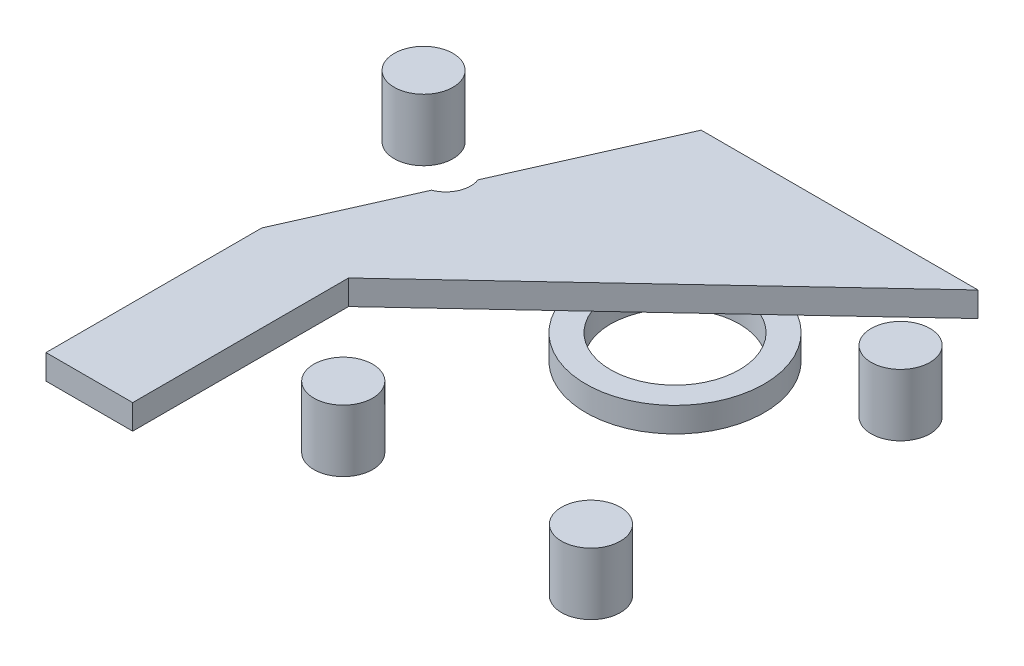
ISO-10303-21;
HEADER;
FILE_DESCRIPTION(('STEP AP214'),'2;1');
FILE_NAME('part.step','',(''),(''),'','','');
FILE_SCHEMA(('AUTOMOTIVE_DESIGN { 1 0 10303 214 1 1 1 1 }'));
ENDSEC;
DATA;
#1=APPLICATION_CONTEXT('core data for automotive mechanical design processes');
#2=APPLICATION_PROTOCOL_DEFINITION('international standard','automotive_design',2000,#1);
#3=PRODUCT_CONTEXT('',#1,'mechanical');
#4=PRODUCT('Part','Part','',(#3));
#5=PRODUCT_RELATED_PRODUCT_CATEGORY('part','',(#4));
#6=PRODUCT_DEFINITION_FORMATION('','',#4);
#7=PRODUCT_DEFINITION_CONTEXT('part definition',#1,'design');
#8=PRODUCT_DEFINITION('design','',#6,#7);
#9=PRODUCT_DEFINITION_SHAPE('','',#8);
#10=(LENGTH_UNIT() NAMED_UNIT(*) SI_UNIT(.MILLI.,.METRE.));
#11=(NAMED_UNIT(*) PLANE_ANGLE_UNIT() SI_UNIT($,.RADIAN.));
#12=(NAMED_UNIT(*) SI_UNIT($,.STERADIAN.) SOLID_ANGLE_UNIT());
#13=UNCERTAINTY_MEASURE_WITH_UNIT(LENGTH_MEASURE(1.E-05),#10,'distance_accuracy_value','');
#14=(GEOMETRIC_REPRESENTATION_CONTEXT(3) GLOBAL_UNCERTAINTY_ASSIGNED_CONTEXT((#13)) GLOBAL_UNIT_ASSIGNED_CONTEXT((#10,
#11,#12)) REPRESENTATION_CONTEXT('',''));
#15=CARTESIAN_POINT('',(0.,0.,0.));
#16=DIRECTION('',(0.,0.,1.));
#17=DIRECTION('',(1.,0.,0.));
#18=AXIS2_PLACEMENT_3D('',#15,#16,#17);
#19=CARTESIAN_POINT('',(28.5000000000002,-5.,-3.28571428571383));
#20=DIRECTION('',(0.,1.,0.));
#21=DIRECTION('',(0.,0.,1.));
#22=AXIS2_PLACEMENT_3D('',#19,#20,#21);
#23=CYLINDRICAL_SURFACE('',#22,2.37499999999999);
#24=CARTESIAN_POINT('',(28.5000000000002,-5.,-3.28571428571383));
#25=DIRECTION('',(0.,-1.,0.));
#26=DIRECTION('',(0.,0.,-1.));
#27=AXIS2_PLACEMENT_3D('',#24,#25,#26);
#28=CIRCLE('',#27,2.37499999999999);
#29=CARTESIAN_POINT('',(28.5000000000002,-5.,-5.66071428571382));
#30=VERTEX_POINT('',#29);
#31=EDGE_CURVE('E11',#30,#30,#28,.T.);
#32=ORIENTED_EDGE('',*,*,#31,.F.);
#33=EDGE_LOOP('',(#32));
#34=FACE_BOUND('',#33,.T.);
#35=CARTESIAN_POINT('',(28.5000000000002,0.,-3.28571428571383));
#36=DIRECTION('',(0.,-1.,0.));
#37=DIRECTION('',(0.,0.,-1.));
#38=AXIS2_PLACEMENT_3D('',#35,#36,#37);
#39=CIRCLE('',#38,2.37499999999999);
#40=CARTESIAN_POINT('',(28.5000000000002,0.,-5.66071428571382));
#41=VERTEX_POINT('',#40);
#42=EDGE_CURVE('E43',#41,#41,#39,.T.);
#43=ORIENTED_EDGE('',*,*,#42,.T.);
#44=EDGE_LOOP('',(#43));
#45=FACE_BOUND('',#44,.T.);
#46=ADVANCED_FACE('F40',(#34,#45),#23,.T.);
#47=CARTESIAN_POINT('',(28.5000000000002,-5.,-3.28571428571383));
#48=DIRECTION('',(0.,-1.,0.));
#49=DIRECTION('',(0.,0.,-1.));
#50=AXIS2_PLACEMENT_3D('',#47,#48,#49);
#51=PLANE('',#50);
#52=ORIENTED_EDGE('',*,*,#31,.T.);
#53=EDGE_LOOP('',(#52));
#54=FACE_BOUND('',#53,.T.);
#55=ADVANCED_FACE('F55',(#54),#51,.T.);
#56=CARTESIAN_POINT('',(28.5000000000002,0.,-3.28571428571383));
#57=DIRECTION('',(0.,-1.,0.));
#58=DIRECTION('',(0.,0.,-1.));
#59=AXIS2_PLACEMENT_3D('',#56,#57,#58);
#60=PLANE('',#59);
#61=ORIENTED_EDGE('',*,*,#42,.F.);
#62=EDGE_LOOP('',(#61));
#63=FACE_BOUND('',#62,.T.);
#64=ADVANCED_FACE('F53',(#63),#60,.F.);
#65=CLOSED_SHELL('',(#46,#55,#64));
#66=MANIFOLD_SOLID_BREP('B2',#65);
#67=CARTESIAN_POINT('',(28.5000000000002,-5.,-28.2857142857138));
#68=DIRECTION('',(0.,1.,0.));
#69=DIRECTION('',(0.,0.,1.));
#70=AXIS2_PLACEMENT_3D('',#67,#68,#69);
#71=CYLINDRICAL_SURFACE('',#70,2.37499999999999);
#72=CARTESIAN_POINT('',(28.5000000000002,-5.,-28.2857142857138));
#73=DIRECTION('',(0.,-1.,0.));
#74=DIRECTION('',(0.,0.,-1.));
#75=AXIS2_PLACEMENT_3D('',#72,#73,#74);
#76=CIRCLE('',#75,2.37499999999999);
#77=CARTESIAN_POINT('',(28.5000000000002,-5.,-30.6607142857138));
#78=VERTEX_POINT('',#77);
#79=EDGE_CURVE('E39',#78,#78,#76,.T.);
#80=ORIENTED_EDGE('',*,*,#79,.F.);
#81=EDGE_LOOP('',(#80));
#82=FACE_BOUND('',#81,.T.);
#83=CARTESIAN_POINT('',(28.5000000000002,0.,-28.2857142857138));
#84=DIRECTION('',(0.,-1.,0.));
#85=DIRECTION('',(0.,0.,-1.));
#86=AXIS2_PLACEMENT_3D('',#83,#84,#85);
#87=CIRCLE('',#86,2.37499999999999);
#88=CARTESIAN_POINT('',(28.5000000000002,0.,-30.6607142857138));
#89=VERTEX_POINT('',#88);
#90=EDGE_CURVE('E92',#89,#89,#87,.T.);
#91=ORIENTED_EDGE('',*,*,#90,.T.);
#92=EDGE_LOOP('',(#91));
#93=FACE_BOUND('',#92,.T.);
#94=ADVANCED_FACE('F89',(#82,#93),#71,.T.);
#95=CARTESIAN_POINT('',(28.5000000000002,-5.,-28.2857142857138));
#96=DIRECTION('',(0.,-1.,0.));
#97=DIRECTION('',(0.,0.,-1.));
#98=AXIS2_PLACEMENT_3D('',#95,#96,#97);
#99=PLANE('',#98);
#100=ORIENTED_EDGE('',*,*,#79,.T.);
#101=EDGE_LOOP('',(#100));
#102=FACE_BOUND('',#101,.T.);
#103=ADVANCED_FACE('F104',(#102),#99,.T.);
#104=CARTESIAN_POINT('',(28.5000000000002,0.,-28.2857142857138));
#105=DIRECTION('',(0.,-1.,0.));
#106=DIRECTION('',(0.,0.,-1.));
#107=AXIS2_PLACEMENT_3D('',#104,#105,#106);
#108=PLANE('',#107);
#109=ORIENTED_EDGE('',*,*,#90,.F.);
#110=EDGE_LOOP('',(#109));
#111=FACE_BOUND('',#110,.T.);
#112=ADVANCED_FACE('F102',(#111),#108,.F.);
#113=CLOSED_SHELL('',(#94,#103,#112));
#114=MANIFOLD_SOLID_BREP('B6',#113);
#115=CARTESIAN_POINT('',(-9.99157016781284,-5.,-28.2644810292485));
#116=DIRECTION('',(0.,1.,0.));
#117=DIRECTION('',(0.,0.,1.));
#118=AXIS2_PLACEMENT_3D('',#115,#116,#117);
#119=CYLINDRICAL_SURFACE('',#118,2.37284542078463);
#120=CARTESIAN_POINT('',(-9.99157016781284,-5.,-28.2644810292485));
#121=DIRECTION('',(0.,-1.,0.));
#122=DIRECTION('',(0.,0.,-1.));
#123=AXIS2_PLACEMENT_3D('',#120,#121,#122);
#124=CIRCLE('',#123,2.37284542078463);
#125=CARTESIAN_POINT('',(-9.99157016781284,-5.,-30.6373264500331));
#126=VERTEX_POINT('',#125);
#127=EDGE_CURVE('E88',#126,#126,#124,.T.);
#128=ORIENTED_EDGE('',*,*,#127,.F.);
#129=EDGE_LOOP('',(#128));
#130=FACE_BOUND('',#129,.T.);
#131=CARTESIAN_POINT('',(-9.99157016781284,0.,-28.2644810292485));
#132=DIRECTION('',(0.,-1.,0.));
#133=DIRECTION('',(0.,0.,-1.));
#134=AXIS2_PLACEMENT_3D('',#131,#132,#133);
#135=CIRCLE('',#134,2.37284542078463);
#136=CARTESIAN_POINT('',(-9.99157016781284,0.,-30.6373264500331));
#137=VERTEX_POINT('',#136);
#138=EDGE_CURVE('E141',#137,#137,#135,.T.);
#139=ORIENTED_EDGE('',*,*,#138,.T.);
#140=EDGE_LOOP('',(#139));
#141=FACE_BOUND('',#140,.T.);
#142=ADVANCED_FACE('F138',(#130,#141),#119,.T.);
#143=CARTESIAN_POINT('',(-9.99157016781284,-5.,-28.2644810292485));
#144=DIRECTION('',(0.,-1.,0.));
#145=DIRECTION('',(0.,0.,-1.));
#146=AXIS2_PLACEMENT_3D('',#143,#144,#145);
#147=PLANE('',#146);
#148=ORIENTED_EDGE('',*,*,#127,.T.);
#149=EDGE_LOOP('',(#148));
#150=FACE_BOUND('',#149,.T.);
#151=ADVANCED_FACE('F153',(#150),#147,.T.);
#152=CARTESIAN_POINT('',(-9.99157016781284,0.,-28.2644810292485));
#153=DIRECTION('',(0.,-1.,0.));
#154=DIRECTION('',(0.,0.,-1.));
#155=AXIS2_PLACEMENT_3D('',#152,#153,#154);
#156=PLANE('',#155);
#157=ORIENTED_EDGE('',*,*,#138,.F.);
#158=EDGE_LOOP('',(#157));
#159=FACE_BOUND('',#158,.T.);
#160=ADVANCED_FACE('F151',(#159),#156,.F.);
#161=CLOSED_SHELL('',(#142,#151,#160));
#162=MANIFOLD_SOLID_BREP('B34',#161);
#163=CARTESIAN_POINT('',(8.50000000000023,-5.,-3.28571428571383));
#164=DIRECTION('',(0.,1.,0.));
#165=DIRECTION('',(0.,0.,1.));
#166=AXIS2_PLACEMENT_3D('',#163,#164,#165);
#167=CYLINDRICAL_SURFACE('',#166,2.37499999999999);
#168=CARTESIAN_POINT('',(8.50000000000023,-5.,-3.28571428571383));
#169=DIRECTION('',(0.,-1.,0.));
#170=DIRECTION('',(0.,0.,-1.));
#171=AXIS2_PLACEMENT_3D('',#168,#169,#170);
#172=CIRCLE('',#171,2.37499999999999);
#173=CARTESIAN_POINT('',(8.50000000000023,-5.,-5.66071428571382));
#174=VERTEX_POINT('',#173);
#175=EDGE_CURVE('E137',#174,#174,#172,.T.);
#176=ORIENTED_EDGE('',*,*,#175,.F.);
#177=EDGE_LOOP('',(#176));
#178=FACE_BOUND('',#177,.T.);
#179=CARTESIAN_POINT('',(8.50000000000023,0.,-3.28571428571383));
#180=DIRECTION('',(0.,-1.,0.));
#181=DIRECTION('',(0.,0.,-1.));
#182=AXIS2_PLACEMENT_3D('',#179,#180,#181);
#183=CIRCLE('',#182,2.37499999999999);
#184=CARTESIAN_POINT('',(8.50000000000023,0.,-5.66071428571382));
#185=VERTEX_POINT('',#184);
#186=EDGE_CURVE('E191',#185,#185,#183,.T.);
#187=ORIENTED_EDGE('',*,*,#186,.T.);
#188=EDGE_LOOP('',(#187));
#189=FACE_BOUND('',#188,.T.);
#190=ADVANCED_FACE('F188',(#178,#189),#167,.T.);
#191=CARTESIAN_POINT('',(8.50000000000023,-5.,-3.28571428571383));
#192=DIRECTION('',(0.,-1.,0.));
#193=DIRECTION('',(0.,0.,-1.));
#194=AXIS2_PLACEMENT_3D('',#191,#192,#193);
#195=PLANE('',#194);
#196=ORIENTED_EDGE('',*,*,#175,.T.);
#197=EDGE_LOOP('',(#196));
#198=FACE_BOUND('',#197,.T.);
#199=ADVANCED_FACE('F203',(#198),#195,.T.);
#200=CARTESIAN_POINT('',(8.50000000000023,0.,-3.28571428571383));
#201=DIRECTION('',(0.,-1.,0.));
#202=DIRECTION('',(0.,0.,-1.));
#203=AXIS2_PLACEMENT_3D('',#200,#201,#202);
#204=PLANE('',#203);
#205=ORIENTED_EDGE('',*,*,#186,.F.);
#206=EDGE_LOOP('',(#205));
#207=FACE_BOUND('',#206,.T.);
#208=ADVANCED_FACE('F201',(#207),#204,.F.);
#209=CLOSED_SHELL('',(#190,#199,#208));
#210=MANIFOLD_SOLID_BREP('B83',#209);
#211=CARTESIAN_POINT('',(0.,0.,0.));
#212=DIRECTION('',(0.,-1.,0.));
#213=DIRECTION('',(0.,0.,-1.));
#214=AXIS2_PLACEMENT_3D('',#211,#212,#213);
#215=PLANE('',#214);
#216=DIRECTION('',(0.730063572861788,0.,-0.683379235549545));
#217=VECTOR('',#216,1.);
#218=CARTESIAN_POINT('',(29.7499999999985,0.,-33.2857142857138));
#219=LINE('',#218,#217);
#220=CARTESIAN_POINT('',(13.6451099059685,0.,-18.2106607010978));
#221=VERTEX_POINT('',#220);
#222=CARTESIAN_POINT('',(20.6790981073804,0.,-24.7948564596984));
#223=VERTEX_POINT('',#222);
#224=EDGE_CURVE('E401',#221,#223,#219,.T.);
#225=ORIENTED_EDGE('',*,*,#224,.F.);
#226=CARTESIAN_POINT('',(18.5000000000002,0.,-20.073465622412));
#227=DIRECTION('',(0.,-1.,0.));
#228=DIRECTION('',(0.,0.,-1.));
#229=AXIS2_PLACEMENT_3D('',#226,#227,#228);
#230=CIRCLE('',#229,5.2);
#231=EDGE_CURVE('E326',#221,#223,#230,.T.);
#232=ORIENTED_EDGE('',*,*,#231,.T.);
#233=EDGE_LOOP('',(#225,#232));
#234=FACE_BOUND('',#233,.T.);
#235=ADVANCED_FACE('F229',(#234),#215,.T.);
#236=CARTESIAN_POINT('',(-3.49999999999978,2.,-8.71428571428616));
#237=DIRECTION('',(0.914096225507389,0.,0.405497337245444));
#238=DIRECTION('',(0.405497337245444,0.,-0.914096225507389));
#239=AXIS2_PLACEMENT_3D('',#236,#237,#238);
#240=PLANE('',#239);
#241=DIRECTION('',(-0.405497337245444,0.,0.914096225507389));
#242=VECTOR('',#241,1.);
#243=CARTESIAN_POINT('',(-3.49999999999978,1.,-8.71428571428616));
#244=LINE('',#243,#242);
#245=CARTESIAN_POINT('',(1.86239086398556,1.,-20.8025062726799));
#246=VERTEX_POINT('',#245);
#247=CARTESIAN_POINT('',(0.70947447417288,1.,-18.2035335459725));
#248=VERTEX_POINT('',#247);
#249=EDGE_CURVE('E186',#246,#248,#244,.T.);
#250=ORIENTED_EDGE('',*,*,#249,.F.);
#251=DIRECTION('',(0.,1.,0.));
#252=VECTOR('',#251,1.);
#253=CARTESIAN_POINT('',(1.86239086398556,1.,-20.8025062726799));
#254=LINE('',#253,#252);
#255=CARTESIAN_POINT('',(1.86239086398556,2.,-20.8025062726799));
#256=VERTEX_POINT('',#255);
#257=EDGE_CURVE('E311',#246,#256,#254,.T.);
#258=ORIENTED_EDGE('',*,*,#257,.T.);
#259=DIRECTION('',(-0.405497337245444,0.,0.914096225507389));
#260=VECTOR('',#259,1.);
#261=CARTESIAN_POINT('',(-3.49999999999978,2.,-8.71428571428616));
#262=LINE('',#261,#260);
#263=CARTESIAN_POINT('',(7.40000000000023,2.,-33.2857142857138));
#264=VERTEX_POINT('',#263);
#265=EDGE_CURVE('E333',#264,#256,#262,.T.);
#266=ORIENTED_EDGE('',*,*,#265,.F.);
#267=DIRECTION('',(0.,-1.,0.));
#268=VECTOR('',#267,1.);
#269=CARTESIAN_POINT('',(7.40000000000023,2.,-33.2857142857138));
#270=LINE('',#269,#268);
#271=CARTESIAN_POINT('',(7.40000000000023,0.,-33.2857142857138));
#272=VERTEX_POINT('',#271);
#273=EDGE_CURVE('E346',#264,#272,#270,.T.);
#274=ORIENTED_EDGE('',*,*,#273,.T.);
#275=DIRECTION('',(-0.405497337245444,0.,0.914096225507389));
#276=VECTOR('',#275,1.);
#277=CARTESIAN_POINT('',(-3.49999999999978,0.,-8.71428571428616));
#278=LINE('',#277,#276);
#279=CARTESIAN_POINT('',(-3.49999999999978,0.,-8.71428571428616));
#280=VERTEX_POINT('',#279);
#281=EDGE_CURVE('E330',#272,#280,#278,.T.);
#282=ORIENTED_EDGE('',*,*,#281,.T.);
#283=DIRECTION('',(0.,-1.,0.));
#284=VECTOR('',#283,1.);
#285=CARTESIAN_POINT('',(-3.49999999999978,2.,-8.71428571428616));
#286=LINE('',#285,#284);
#287=CARTESIAN_POINT('',(-3.49999999999978,2.,-8.71428571428616));
#288=VERTEX_POINT('',#287);
#289=EDGE_CURVE('E375',#288,#280,#286,.T.);
#290=ORIENTED_EDGE('',*,*,#289,.F.);
#291=CARTESIAN_POINT('',(0.70947447417288,2.,-18.2035335459725));
#292=VERTEX_POINT('',#291);
#293=EDGE_CURVE('E316',#292,#288,#262,.T.);
#294=ORIENTED_EDGE('',*,*,#293,.F.);
#295=DIRECTION('',(0.,1.,0.));
#296=VECTOR('',#295,1.);
#297=CARTESIAN_POINT('',(0.70947447417288,1.,-18.2035335459725));
#298=LINE('',#297,#296);
#299=EDGE_CURVE('E244',#292,#248,#298,.F.);
#300=ORIENTED_EDGE('',*,*,#299,.T.);
#301=EDGE_LOOP('',(#250,#258,#266,#274,#282,#290,#294,#300));
#302=FACE_BOUND('',#301,.T.);
#303=ADVANCED_FACE('F231',(#302),#240,.F.);
#304=CARTESIAN_POINT('',(-3.49999999999978,2.,-8.71428571428616));
#305=DIRECTION('',(1.,0.,0.));
#306=DIRECTION('',(0.,0.,-1.));
#307=AXIS2_PLACEMENT_3D('',#304,#305,#306);
#308=PLANE('',#307);
#309=DIRECTION('',(0.,0.,1.));
#310=VECTOR('',#309,1.);
#311=CARTESIAN_POINT('',(-3.49999999999978,0.,-8.71428571428616));
#312=LINE('',#311,#310);
#313=CARTESIAN_POINT('',(-3.49999999999978,0.,8.71428571428616));
#314=VERTEX_POINT('',#313);
#315=EDGE_CURVE('E349',#280,#314,#312,.T.);
#316=ORIENTED_EDGE('',*,*,#315,.T.);
#317=DIRECTION('',(0.,-1.,0.));
#318=VECTOR('',#317,1.);
#319=CARTESIAN_POINT('',(-3.49999999999978,2.,8.71428571428616));
#320=LINE('',#319,#318);
#321=CARTESIAN_POINT('',(-3.49999999999978,2.,8.71428571428616));
#322=VERTEX_POINT('',#321);
#323=EDGE_CURVE('E373',#322,#314,#320,.T.);
#324=ORIENTED_EDGE('',*,*,#323,.F.);
#325=DIRECTION('',(0.,0.,1.));
#326=VECTOR('',#325,1.);
#327=CARTESIAN_POINT('',(-3.49999999999978,2.,-8.71428571428616));
#328=LINE('',#327,#326);
#329=EDGE_CURVE('E336',#288,#322,#328,.T.);
#330=ORIENTED_EDGE('',*,*,#329,.F.);
#331=ORIENTED_EDGE('',*,*,#289,.T.);
#332=EDGE_LOOP('',(#316,#324,#330,#331));
#333=FACE_BOUND('',#332,.T.);
#334=ADVANCED_FACE('F414',(#333),#308,.F.);
#335=CARTESIAN_POINT('',(-3.49999999999978,2.,8.71428571428616));
#336=DIRECTION('',(0.,0.,-1.));
#337=DIRECTION('',(-1.,0.,0.));
#338=AXIS2_PLACEMENT_3D('',#335,#336,#337);
#339=PLANE('',#338);
#340=DIRECTION('',(1.,0.,0.));
#341=VECTOR('',#340,1.);
#342=CARTESIAN_POINT('',(-3.49999999999978,0.,8.71428571428616));
#343=LINE('',#342,#341);
#344=CARTESIAN_POINT('',(3.49999999999978,0.,8.71428571428616));
#345=VERTEX_POINT('',#344);
#346=EDGE_CURVE('E351',#314,#345,#343,.T.);
#347=ORIENTED_EDGE('',*,*,#346,.T.);
#348=DIRECTION('',(0.,-1.,0.));
#349=VECTOR('',#348,1.);
#350=CARTESIAN_POINT('',(3.49999999999978,2.,8.71428571428616));
#351=LINE('',#350,#349);
#352=CARTESIAN_POINT('',(3.49999999999978,2.,8.71428571428616));
#353=VERTEX_POINT('',#352);
#354=EDGE_CURVE('E370',#353,#345,#351,.T.);
#355=ORIENTED_EDGE('',*,*,#354,.F.);
#356=DIRECTION('',(1.,0.,0.));
#357=VECTOR('',#356,1.);
#358=CARTESIAN_POINT('',(-3.49999999999978,2.,8.71428571428616));
#359=LINE('',#358,#357);
#360=EDGE_CURVE('E338',#322,#353,#359,.T.);
#361=ORIENTED_EDGE('',*,*,#360,.F.);
#362=ORIENTED_EDGE('',*,*,#323,.T.);
#363=EDGE_LOOP('',(#347,#355,#361,#362));
#364=FACE_BOUND('',#363,.T.);
#365=ADVANCED_FACE('F412',(#364),#339,.F.);
#366=CARTESIAN_POINT('',(3.49999999999978,2.,-8.71428571428616));
#367=DIRECTION('',(-1.,0.,0.));
#368=DIRECTION('',(0.,0.,1.));
#369=AXIS2_PLACEMENT_3D('',#366,#367,#368);
#370=PLANE('',#369);
#371=DIRECTION('',(0.,0.,-1.));
#372=VECTOR('',#371,1.);
#373=CARTESIAN_POINT('',(3.49999999999978,0.,-8.71428571428616));
#374=LINE('',#373,#372);
#375=CARTESIAN_POINT('',(3.49999999999978,0.,-8.71428571428616));
#376=VERTEX_POINT('',#375);
#377=EDGE_CURVE('E353',#345,#376,#374,.T.);
#378=ORIENTED_EDGE('',*,*,#377,.T.);
#379=DIRECTION('',(0.,-1.,0.));
#380=VECTOR('',#379,1.);
#381=CARTESIAN_POINT('',(3.49999999999978,2.,-8.71428571428616));
#382=LINE('',#381,#380);
#383=CARTESIAN_POINT('',(3.49999999999978,2.,-8.71428571428616));
#384=VERTEX_POINT('',#383);
#385=EDGE_CURVE('E367',#384,#376,#382,.T.);
#386=ORIENTED_EDGE('',*,*,#385,.F.);
#387=DIRECTION('',(0.,0.,-1.));
#388=VECTOR('',#387,1.);
#389=CARTESIAN_POINT('',(3.49999999999978,2.,-8.71428571428616));
#390=LINE('',#389,#388);
#391=EDGE_CURVE('E340',#353,#384,#390,.T.);
#392=ORIENTED_EDGE('',*,*,#391,.F.);
#393=ORIENTED_EDGE('',*,*,#354,.T.);
#394=EDGE_LOOP('',(#378,#386,#392,#393));
#395=FACE_BOUND('',#394,.T.);
#396=ADVANCED_FACE('F407',(#395),#370,.F.);
#397=CARTESIAN_POINT('',(29.7499999999985,2.,-33.2857142857138));
#398=DIRECTION('',(-0.683379235549545,0.,-0.730063572861788));
#399=DIRECTION('',(-0.730063572861788,0.,0.683379235549545));
#400=AXIS2_PLACEMENT_3D('',#397,#398,#399);
#401=PLANE('',#400);
#402=CARTESIAN_POINT('',(12.1036981855872,0.,-16.7678154444687));
#403=VERTEX_POINT('',#402);
#404=EDGE_CURVE('E356',#376,#403,#219,.T.);
#405=ORIENTED_EDGE('',*,*,#404,.T.);
#406=EDGE_CURVE('E360',#403,#221,#219,.T.);
#407=ORIENTED_EDGE('',*,*,#406,.T.);
#408=ORIENTED_EDGE('',*,*,#224,.T.);
#409=CARTESIAN_POINT('',(22.2205098277617,0.,-26.2377017163275));
#410=VERTEX_POINT('',#409);
#411=EDGE_CURVE('E393',#223,#410,#219,.T.);
#412=ORIENTED_EDGE('',*,*,#411,.T.);
#413=CARTESIAN_POINT('',(29.7499999999985,0.,-33.2857142857138));
#414=VERTEX_POINT('',#413);
#415=EDGE_CURVE('E355',#410,#414,#219,.T.);
#416=ORIENTED_EDGE('',*,*,#415,.T.);
#417=DIRECTION('',(0.,-1.,0.));
#418=VECTOR('',#417,1.);
#419=CARTESIAN_POINT('',(29.7499999999985,2.,-33.2857142857138));
#420=LINE('',#419,#418);
#421=CARTESIAN_POINT('',(29.7499999999985,2.,-33.2857142857138));
#422=VERTEX_POINT('',#421);
#423=EDGE_CURVE('E364',#422,#414,#420,.T.);
#424=ORIENTED_EDGE('',*,*,#423,.F.);
#425=DIRECTION('',(0.730063572861788,0.,-0.683379235549545));
#426=VECTOR('',#425,1.);
#427=CARTESIAN_POINT('',(29.7499999999985,2.,-33.2857142857138));
#428=LINE('',#427,#426);
#429=EDGE_CURVE('E342',#384,#422,#428,.T.);
#430=ORIENTED_EDGE('',*,*,#429,.F.);
#431=ORIENTED_EDGE('',*,*,#385,.T.);
#432=EDGE_LOOP('',(#405,#407,#408,#412,#416,#424,#430,#431));
#433=FACE_BOUND('',#432,.T.);
#434=ADVANCED_FACE('F400',(#433),#401,.F.);
#435=CARTESIAN_POINT('',(7.40000000000023,2.,-33.2857142857138));
#436=DIRECTION('',(0.,0.,1.));
#437=DIRECTION('',(1.,0.,0.));
#438=AXIS2_PLACEMENT_3D('',#435,#436,#437);
#439=PLANE('',#438);
#440=DIRECTION('',(-1.,0.,0.));
#441=VECTOR('',#440,1.);
#442=CARTESIAN_POINT('',(7.40000000000023,0.,-33.2857142857138));
#443=LINE('',#442,#441);
#444=EDGE_CURVE('E359',#414,#272,#443,.T.);
#445=ORIENTED_EDGE('',*,*,#444,.T.);
#446=ORIENTED_EDGE('',*,*,#273,.F.);
#447=DIRECTION('',(-1.,0.,0.));
#448=VECTOR('',#447,1.);
#449=CARTESIAN_POINT('',(7.40000000000023,2.,-33.2857142857138));
#450=LINE('',#449,#448);
#451=EDGE_CURVE('E344',#422,#264,#450,.T.);
#452=ORIENTED_EDGE('',*,*,#451,.F.);
#453=ORIENTED_EDGE('',*,*,#423,.T.);
#454=EDGE_LOOP('',(#445,#446,#452,#453));
#455=FACE_BOUND('',#454,.T.);
#456=ADVANCED_FACE('F419',(#455),#439,.F.);
#457=CARTESIAN_POINT('',(0.,2.,0.));
#458=DIRECTION('',(0.,-1.,0.));
#459=DIRECTION('',(0.,0.,-1.));
#460=AXIS2_PLACEMENT_3D('',#457,#458,#459);
#461=PLANE('',#460);
#462=ORIENTED_EDGE('',*,*,#265,.T.);
#463=CARTESIAN_POINT('',(0.,2.,-20.073465622412));
#464=DIRECTION('',(0.,1.,0.));
#465=DIRECTION('',(0.,0.,1.));
#466=AXIS2_PLACEMENT_3D('',#463,#464,#465);
#467=CIRCLE('',#466,2.);
#468=EDGE_CURVE('E312',#292,#256,#467,.T.);
#469=ORIENTED_EDGE('',*,*,#468,.F.);
#470=ORIENTED_EDGE('',*,*,#293,.T.);
#471=ORIENTED_EDGE('',*,*,#329,.T.);
#472=ORIENTED_EDGE('',*,*,#360,.T.);
#473=ORIENTED_EDGE('',*,*,#391,.T.);
#474=ORIENTED_EDGE('',*,*,#429,.T.);
#475=ORIENTED_EDGE('',*,*,#451,.T.);
#476=EDGE_LOOP('',(#462,#469,#470,#471,#472,#473,#474,#475));
#477=FACE_BOUND('',#476,.T.);
#478=ADVANCED_FACE('F421',(#477),#461,.F.);
#479=CARTESIAN_POINT('',(18.5000000000002,0.,-20.073465622412));
#480=DIRECTION('',(0.,-1.,0.));
#481=DIRECTION('',(0.,0.,-1.));
#482=AXIS2_PLACEMENT_3D('',#479,#480,#481);
#483=CIRCLE('',#482,7.2);
#484=EDGE_CURVE('E237',#403,#410,#483,.T.);
#485=ORIENTED_EDGE('',*,*,#484,.F.);
#486=ORIENTED_EDGE('',*,*,#404,.F.);
#487=ORIENTED_EDGE('',*,*,#377,.F.);
#488=ORIENTED_EDGE('',*,*,#346,.F.);
#489=ORIENTED_EDGE('',*,*,#315,.F.);
#490=ORIENTED_EDGE('',*,*,#281,.F.);
#491=ORIENTED_EDGE('',*,*,#444,.F.);
#492=ORIENTED_EDGE('',*,*,#415,.F.);
#493=EDGE_LOOP('',(#485,#486,#487,#488,#489,#490,#491,#492));
#494=FACE_BOUND('',#493,.T.);
#495=ADVANCED_FACE('F396',(#494),#215,.T.);
#496=CARTESIAN_POINT('',(18.5000000000002,-2.,-20.073465622412));
#497=DIRECTION('',(0.,-1.,0.));
#498=DIRECTION('',(0.,0.,-1.));
#499=AXIS2_PLACEMENT_3D('',#496,#497,#498);
#500=PLANE('',#499);
#501=CARTESIAN_POINT('',(18.5000000000002,-2.,-20.073465622412));
#502=DIRECTION('',(0.,-1.,0.));
#503=DIRECTION('',(0.,0.,-1.));
#504=AXIS2_PLACEMENT_3D('',#501,#502,#503);
#505=CIRCLE('',#504,7.2);
#506=CARTESIAN_POINT('',(18.5000000000002,-2.,-27.273465622412));
#507=VERTEX_POINT('',#506);
#508=EDGE_CURVE('E327',#507,#507,#505,.T.);
#509=ORIENTED_EDGE('',*,*,#508,.T.);
#510=EDGE_LOOP('',(#509));
#511=FACE_BOUND('',#510,.T.);
#512=CARTESIAN_POINT('',(18.5000000000002,-2.,-20.073465622412));
#513=DIRECTION('',(0.,-1.,0.));
#514=DIRECTION('',(0.,0.,-1.));
#515=AXIS2_PLACEMENT_3D('',#512,#513,#514);
#516=CIRCLE('',#515,5.2);
#517=CARTESIAN_POINT('',(18.5000000000002,-2.,-25.273465622412));
#518=VERTEX_POINT('',#517);
#519=EDGE_CURVE('E321',#518,#518,#516,.T.);
#520=ORIENTED_EDGE('',*,*,#519,.F.);
#521=EDGE_LOOP('',(#520));
#522=FACE_BOUND('',#521,.T.);
#523=ADVANCED_FACE('F428',(#511,#522),#500,.T.);
#524=CARTESIAN_POINT('',(18.5000000000002,0.,-20.073465622412));
#525=DIRECTION('',(0.,-1.,0.));
#526=DIRECTION('',(0.,0.,-1.));
#527=AXIS2_PLACEMENT_3D('',#524,#525,#526);
#528=PLANE('',#527);
#529=ORIENTED_EDGE('',*,*,#406,.F.);
#530=EDGE_CURVE('E324',#410,#403,#483,.T.);
#531=ORIENTED_EDGE('',*,*,#530,.F.);
#532=ORIENTED_EDGE('',*,*,#411,.F.);
#533=EDGE_CURVE('E251',#223,#221,#230,.T.);
#534=ORIENTED_EDGE('',*,*,#533,.T.);
#535=EDGE_LOOP('',(#529,#531,#532,#534));
#536=FACE_BOUND('',#535,.T.);
#537=ADVANCED_FACE('F391',(#536),#528,.F.);
#538=CARTESIAN_POINT('',(18.5000000000002,-2.,-20.073465622412));
#539=DIRECTION('',(0.,1.,0.));
#540=DIRECTION('',(0.,0.,1.));
#541=AXIS2_PLACEMENT_3D('',#538,#539,#540);
#542=CYLINDRICAL_SURFACE('',#541,7.2);
#543=ORIENTED_EDGE('',*,*,#508,.F.);
#544=EDGE_LOOP('',(#543));
#545=FACE_BOUND('',#544,.T.);
#546=ORIENTED_EDGE('',*,*,#530,.T.);
#547=ORIENTED_EDGE('',*,*,#484,.T.);
#548=EDGE_LOOP('',(#546,#547));
#549=FACE_BOUND('',#548,.T.);
#550=ADVANCED_FACE('F386',(#545,#549),#542,.T.);
#551=CARTESIAN_POINT('',(18.5000000000002,-2.,-20.073465622412));
#552=DIRECTION('',(0.,1.,0.));
#553=DIRECTION('',(0.,0.,1.));
#554=AXIS2_PLACEMENT_3D('',#551,#552,#553);
#555=CYLINDRICAL_SURFACE('',#554,5.2);
#556=ORIENTED_EDGE('',*,*,#519,.T.);
#557=EDGE_LOOP('',(#556));
#558=FACE_BOUND('',#557,.T.);
#559=ORIENTED_EDGE('',*,*,#533,.F.);
#560=ORIENTED_EDGE('',*,*,#231,.F.);
#561=EDGE_LOOP('',(#559,#560));
#562=FACE_BOUND('',#561,.T.);
#563=ADVANCED_FACE('F497',(#558,#562),#555,.F.);
#564=CARTESIAN_POINT('',(0.,1.,-20.073465622412));
#565=DIRECTION('',(0.,1.,0.));
#566=DIRECTION('',(0.,0.,1.));
#567=AXIS2_PLACEMENT_3D('',#564,#565,#566);
#568=PLANE('',#567);
#569=ORIENTED_EDGE('',*,*,#249,.T.);
#570=CARTESIAN_POINT('',(0.,1.,-20.073465622412));
#571=DIRECTION('',(0.,1.,0.));
#572=DIRECTION('',(0.,0.,1.));
#573=AXIS2_PLACEMENT_3D('',#570,#571,#572);
#574=CIRCLE('',#573,2.);
#575=EDGE_CURVE('E307',#248,#246,#574,.T.);
#576=ORIENTED_EDGE('',*,*,#575,.T.);
#577=EDGE_LOOP('',(#569,#576));
#578=FACE_BOUND('',#577,.T.);
#579=ADVANCED_FACE('F306',(#578),#568,.T.);
#580=CARTESIAN_POINT('',(0.,1.,-20.073465622412));
#581=DIRECTION('',(0.,1.,0.));
#582=DIRECTION('',(0.,0.,1.));
#583=AXIS2_PLACEMENT_3D('',#580,#581,#582);
#584=CYLINDRICAL_SURFACE('',#583,2.);
#585=ORIENTED_EDGE('',*,*,#575,.F.);
#586=ORIENTED_EDGE('',*,*,#299,.F.);
#587=ORIENTED_EDGE('',*,*,#468,.T.);
#588=ORIENTED_EDGE('',*,*,#257,.F.);
#589=EDGE_LOOP('',(#585,#586,#587,#588));
#590=FACE_BOUND('',#589,.T.);
#591=ADVANCED_FACE('F310',(#590),#584,.F.);
#592=CLOSED_SHELL('',(#235,#303,#334,#365,#396,#434,#456,#478,#495,#523,#537,#550,#563,#579,#591));
#593=MANIFOLD_SOLID_BREP('B132',#592);
#594=ADVANCED_BREP_SHAPE_REPRESENTATION('',(#18,#66,#114,#162,#210,#593),#14);
#595=SHAPE_DEFINITION_REPRESENTATION(#9,#594);
ENDSEC;
END-ISO-10303-21;
